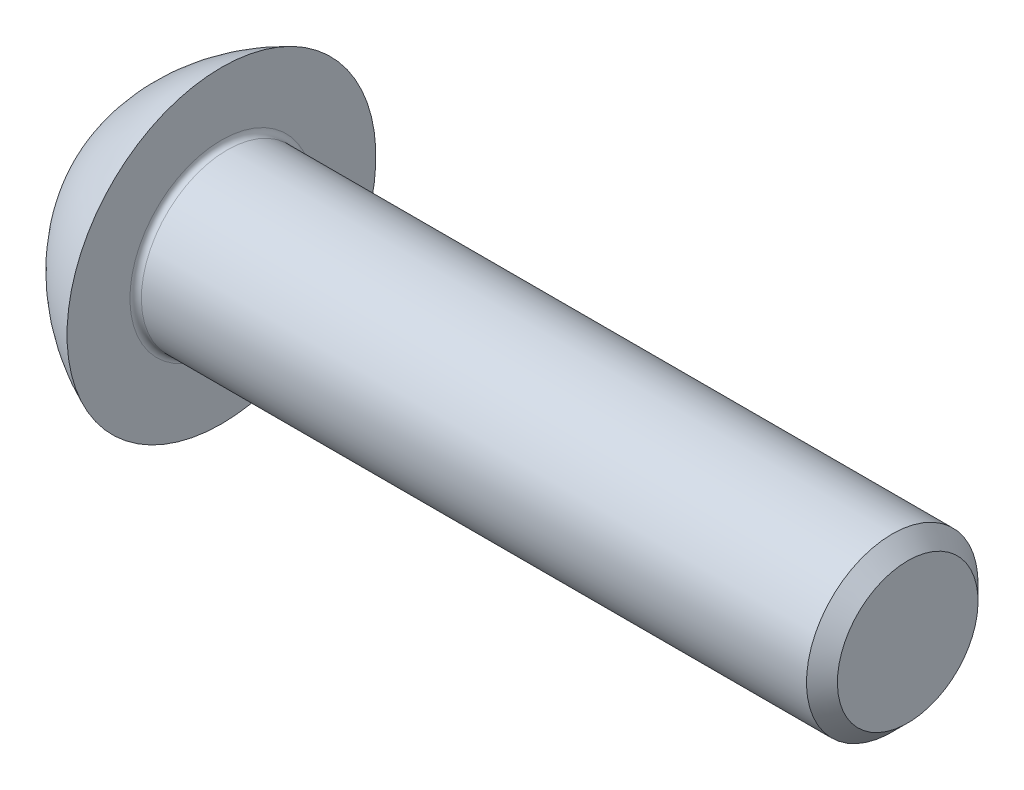
ISO-10303-21;
HEADER;
FILE_DESCRIPTION(('STEP AP214'),'2;1');
FILE_NAME('part.step','',(''),(''),'','','');
FILE_SCHEMA(('AUTOMOTIVE_DESIGN { 1 0 10303 214 1 1 1 1 }'));
ENDSEC;
DATA;
#1=APPLICATION_CONTEXT('core data for automotive mechanical design processes');
#2=APPLICATION_PROTOCOL_DEFINITION('international standard','automotive_design',2000,#1);
#3=PRODUCT_CONTEXT('',#1,'mechanical');
#4=PRODUCT('Part','Part','',(#3));
#5=PRODUCT_RELATED_PRODUCT_CATEGORY('part','',(#4));
#6=PRODUCT_DEFINITION_FORMATION('','',#4);
#7=PRODUCT_DEFINITION_CONTEXT('part definition',#1,'design');
#8=PRODUCT_DEFINITION('design','',#6,#7);
#9=PRODUCT_DEFINITION_SHAPE('','',#8);
#10=(LENGTH_UNIT() NAMED_UNIT(*) SI_UNIT(.MILLI.,.METRE.));
#11=(NAMED_UNIT(*) PLANE_ANGLE_UNIT() SI_UNIT($,.RADIAN.));
#12=(NAMED_UNIT(*) SI_UNIT($,.STERADIAN.) SOLID_ANGLE_UNIT());
#13=UNCERTAINTY_MEASURE_WITH_UNIT(LENGTH_MEASURE(1.E-05),#10,'distance_accuracy_value','');
#14=(GEOMETRIC_REPRESENTATION_CONTEXT(3) GLOBAL_UNCERTAINTY_ASSIGNED_CONTEXT((#13)) GLOBAL_UNIT_ASSIGNED_CONTEXT((#10,
#11,#12)) REPRESENTATION_CONTEXT('',''));
#15=CARTESIAN_POINT('',(0.,0.,0.));
#16=DIRECTION('',(0.,0.,1.));
#17=DIRECTION('',(1.,0.,0.));
#18=AXIS2_PLACEMENT_3D('',#15,#16,#17);
#19=CARTESIAN_POINT('',(-1.,-0.900666419935816,0.52));
#20=DIRECTION('',(0.,-0.866025403784439,0.5));
#21=DIRECTION('',(0.,-0.5,-0.866025403784439));
#22=AXIS2_PLACEMENT_3D('',#19,#20,#21);
#23=PLANE('',#22);
#24=DIRECTION('',(0.,-0.5,-0.866025403784439));
#25=VECTOR('',#24,1.);
#26=CARTESIAN_POINT('',(0.,-0.819416419935816,0.660729128114971));
#27=LINE('',#26,#25);
#28=CARTESIAN_POINT('',(0.,-0.600444279957211,1.04));
#29=VERTEX_POINT('',#28);
#30=CARTESIAN_POINT('',(0.,-1.20088855991442,0.));
#31=VERTEX_POINT('',#30);
#32=EDGE_CURVE('E32',#29,#31,#27,.T.);
#33=ORIENTED_EDGE('',*,*,#32,.F.);
#34=DIRECTION('',(1.,0.,0.));
#35=VECTOR('',#34,1.);
#36=CARTESIAN_POINT('',(-1.,-0.600444279957211,1.04));
#37=LINE('',#36,#35);
#38=CARTESIAN_POINT('',(1.04,-0.600444279957211,1.04));
#39=VERTEX_POINT('',#38);
#40=EDGE_CURVE('E11',#29,#39,#37,.T.);
#41=ORIENTED_EDGE('',*,*,#40,.T.);
#42=DIRECTION('',(0.,0.5,0.866025403784439));
#43=VECTOR('',#42,1.);
#44=CARTESIAN_POINT('',(1.04,-0.600444279957211,1.04));
#45=LINE('',#44,#43);
#46=CARTESIAN_POINT('',(1.04,-0.752876240745874,0.775980099216687));
#47=VERTEX_POINT('',#46);
#48=EDGE_CURVE('E232',#47,#39,#45,.T.);
#49=ORIENTED_EDGE('',*,*,#48,.F.);
#50=CARTESIAN_POINT('',(1.04,-0.752876240745875,0.775980099216688));
#51=CARTESIAN_POINT('',(1.03905947423286,-0.74357721040589,0.792086492226667));
#52=CARTESIAN_POINT('',(1.038,-0.73418518976256,0.808353949166648));
#53=(BOUNDED_CURVE() B_SPLINE_CURVE(2,(#50,#51,#52),.UNSPECIFIED.,.F.,
.F.) B_SPLINE_CURVE_WITH_KNOTS((3,3),(0.,0.0374356048378607),
.UNSPECIFIED.) CURVE() GEOMETRIC_REPRESENTATION_ITEM() RATIONAL_B_SPLINE_CURVE((1.,
1.00014797863071,1.)) REPRESENTATION_ITEM(''));
#54=CARTESIAN_POINT('',(1.038,-0.734185189762562,0.808353949166645));
#55=VERTEX_POINT('',#54);
#56=EDGE_CURVE('E25',#47,#55,#53,.T.);
#57=ORIENTED_EDGE('',*,*,#56,.T.);
#58=DIRECTION('',(0.,-0.5,-0.866025403784439));
#59=VECTOR('',#58,1.);
#60=CARTESIAN_POINT('',(1.038,-0.832416419935816,0.638212467616576));
#61=LINE('',#60,#59);
#62=CARTESIAN_POINT('',(1.038,-1.06714765010907,0.231646050833355));
#63=VERTEX_POINT('',#62);
#64=EDGE_CURVE('E150',#55,#63,#61,.T.);
#65=ORIENTED_EDGE('',*,*,#64,.T.);
#66=CARTESIAN_POINT('',(1.038,-1.06714765010907,0.231646050833352));
#67=CARTESIAN_POINT('',(1.03905947423286,-1.05775562946574,0.247913507773334));
#68=CARTESIAN_POINT('',(1.04,-1.04845659912576,0.264019900783313));
#69=(BOUNDED_CURVE() B_SPLINE_CURVE(2,(#66,#67,#68),.UNSPECIFIED.,.F.,
.F.) B_SPLINE_CURVE_WITH_KNOTS((3,3),(0.,0.0374356048378611),
.UNSPECIFIED.) CURVE() GEOMETRIC_REPRESENTATION_ITEM() RATIONAL_B_SPLINE_CURVE((1.,
1.00014797861765,1.)) REPRESENTATION_ITEM(''));
#70=CARTESIAN_POINT('',(1.04,-1.04845659912576,0.264019900783312));
#71=VERTEX_POINT('',#70);
#72=EDGE_CURVE('E138',#63,#71,#69,.T.);
#73=ORIENTED_EDGE('',*,*,#72,.T.);
#74=DIRECTION('',(0.,0.5,0.866025403784439));
#75=VECTOR('',#74,1.);
#76=CARTESIAN_POINT('',(1.04,-0.600444279957211,1.04));
#77=LINE('',#76,#75);
#78=CARTESIAN_POINT('',(1.04,-1.20088855991442,0.));
#79=VERTEX_POINT('',#78);
#80=EDGE_CURVE('E231',#79,#71,#77,.T.);
#81=ORIENTED_EDGE('',*,*,#80,.F.);
#82=DIRECTION('',(1.,0.,0.));
#83=VECTOR('',#82,1.);
#84=CARTESIAN_POINT('',(-1.,-1.20088855991442,0.));
#85=LINE('',#84,#83);
#86=EDGE_CURVE('E151',#31,#79,#85,.T.);
#87=ORIENTED_EDGE('',*,*,#86,.F.);
#88=EDGE_LOOP('',(#33,#41,#49,#57,#65,#73,#81,#87));
#89=FACE_BOUND('',#88,.T.);
#90=ADVANCED_FACE('F16',(#89),#23,.F.);
#91=CARTESIAN_POINT('',(-1.,-0.900666419935816,-0.52));
#92=DIRECTION('',(0.,-0.866025403784439,-0.5));
#93=DIRECTION('',(0.,0.5,-0.866025403784439));
#94=AXIS2_PLACEMENT_3D('',#91,#92,#93);
#95=PLANE('',#94);
#96=DIRECTION('',(0.,0.5,-0.866025403784439));
#97=VECTOR('',#96,1.);
#98=CARTESIAN_POINT('',(0.,-0.819416419935816,-0.660729128114971));
#99=LINE('',#98,#97);
#100=CARTESIAN_POINT('',(0.,-0.600444279957211,-1.04));
#101=VERTEX_POINT('',#100);
#102=EDGE_CURVE('E168',#31,#101,#99,.T.);
#103=ORIENTED_EDGE('',*,*,#102,.F.);
#104=ORIENTED_EDGE('',*,*,#86,.T.);
#105=DIRECTION('',(0.,-0.5,0.866025403784439));
#106=VECTOR('',#105,1.);
#107=CARTESIAN_POINT('',(1.04,-1.20088855991442,0.));
#108=LINE('',#107,#106);
#109=CARTESIAN_POINT('',(1.04,-1.04845659912576,-0.264019900783312));
#110=VERTEX_POINT('',#109);
#111=EDGE_CURVE('E274',#110,#79,#108,.T.);
#112=ORIENTED_EDGE('',*,*,#111,.F.);
#113=CARTESIAN_POINT('',(1.04,-1.04845659912576,-0.264019900783312));
#114=CARTESIAN_POINT('',(1.03905947423287,-1.05775562946569,-0.247913507773424));
#115=CARTESIAN_POINT('',(1.038,-1.06714765010907,-0.23164605083335));
#116=(BOUNDED_CURVE() B_SPLINE_CURVE(2,(#113,#114,#115),.UNSPECIFIED.,.F.,
.F.) B_SPLINE_CURVE_WITH_KNOTS((3,3),(0.,0.0374356048378617),
.UNSPECIFIED.) CURVE() GEOMETRIC_REPRESENTATION_ITEM() RATIONAL_B_SPLINE_CURVE((1.,
1.00014797862095,1.)) REPRESENTATION_ITEM(''));
#117=CARTESIAN_POINT('',(1.038,-1.06714765010907,-0.231646050833354));
#118=VERTEX_POINT('',#117);
#119=EDGE_CURVE('E268',#110,#118,#116,.T.);
#120=ORIENTED_EDGE('',*,*,#119,.T.);
#121=DIRECTION('',(0.,0.5,-0.866025403784439));
#122=VECTOR('',#121,1.);
#123=CARTESIAN_POINT('',(1.038,-0.832416419935816,-0.638212467616576));
#124=LINE('',#123,#122);
#125=CARTESIAN_POINT('',(1.038,-0.734185189762562,-0.808353949166645));
#126=VERTEX_POINT('',#125);
#127=EDGE_CURVE('E265',#118,#126,#124,.T.);
#128=ORIENTED_EDGE('',*,*,#127,.T.);
#129=CARTESIAN_POINT('',(1.038,-0.734185189762559,-0.808353949166649));
#130=CARTESIAN_POINT('',(1.03905947423287,-0.743577210405941,-0.792086492226576));
#131=CARTESIAN_POINT('',(1.04,-0.752876240745874,-0.775980099216688));
#132=(BOUNDED_CURVE() B_SPLINE_CURVE(2,(#129,#130,#131),.UNSPECIFIED.,.F.,
.F.) B_SPLINE_CURVE_WITH_KNOTS((3,3),(0.,0.0374356048378615),
.UNSPECIFIED.) CURVE() GEOMETRIC_REPRESENTATION_ITEM() RATIONAL_B_SPLINE_CURVE((1.,
1.00014797861121,1.)) REPRESENTATION_ITEM(''));
#133=CARTESIAN_POINT('',(1.04,-0.752876240745874,-0.775980099216688));
#134=VERTEX_POINT('',#133);
#135=EDGE_CURVE('E269',#126,#134,#132,.T.);
#136=ORIENTED_EDGE('',*,*,#135,.T.);
#137=DIRECTION('',(0.,-0.5,0.866025403784439));
#138=VECTOR('',#137,1.);
#139=CARTESIAN_POINT('',(1.04,-1.20088855991442,0.));
#140=LINE('',#139,#138);
#141=CARTESIAN_POINT('',(1.04,-0.600444279957211,-1.04));
#142=VERTEX_POINT('',#141);
#143=EDGE_CURVE('E244',#142,#134,#140,.T.);
#144=ORIENTED_EDGE('',*,*,#143,.F.);
#145=DIRECTION('',(1.,0.,0.));
#146=VECTOR('',#145,1.);
#147=CARTESIAN_POINT('',(-1.,-0.600444279957211,-1.04));
#148=LINE('',#147,#146);
#149=EDGE_CURVE('E257',#101,#142,#148,.T.);
#150=ORIENTED_EDGE('',*,*,#149,.F.);
#151=EDGE_LOOP('',(#103,#104,#112,#120,#128,#136,#144,#150));
#152=FACE_BOUND('',#151,.T.);
#153=ADVANCED_FACE('F388',(#152),#95,.F.);
#154=CARTESIAN_POINT('',(-1.,0.,-1.04));
#155=DIRECTION('',(0.,0.,-1.));
#156=DIRECTION('',(0.,1.,0.));
#157=AXIS2_PLACEMENT_3D('',#154,#155,#156);
#158=PLANE('',#157);
#159=DIRECTION('',(0.,1.,0.));
#160=VECTOR('',#159,1.);
#161=CARTESIAN_POINT('',(0.,0.325,-1.04));
#162=LINE('',#161,#160);
#163=CARTESIAN_POINT('',(0.,0.60044427995721,-1.04));
#164=VERTEX_POINT('',#163);
#165=EDGE_CURVE('E171',#101,#164,#162,.T.);
#166=ORIENTED_EDGE('',*,*,#165,.F.);
#167=ORIENTED_EDGE('',*,*,#149,.T.);
#168=DIRECTION('',(0.,-1.,0.));
#169=VECTOR('',#168,1.);
#170=CARTESIAN_POINT('',(1.04,-0.600444279957211,-1.04));
#171=LINE('',#170,#169);
#172=CARTESIAN_POINT('',(1.04,-0.295580358379884,-1.04));
#173=VERTEX_POINT('',#172);
#174=EDGE_CURVE('E249',#173,#142,#171,.T.);
#175=ORIENTED_EDGE('',*,*,#174,.F.);
#176=CARTESIAN_POINT('',(1.04,-0.295580358379884,-1.04));
#177=CARTESIAN_POINT('',(1.03905947423286,-0.314178419059819,-1.04));
#178=CARTESIAN_POINT('',(1.038,-0.332962460346514,-1.04));
#179=(BOUNDED_CURVE() B_SPLINE_CURVE(2,(#176,#177,#178),.UNSPECIFIED.,.F.,
.F.) B_SPLINE_CURVE_WITH_KNOTS((3,3),(0.,0.0374356048378617),
.UNSPECIFIED.) CURVE() GEOMETRIC_REPRESENTATION_ITEM() RATIONAL_B_SPLINE_CURVE((1.,
1.00014797861979,1.)) REPRESENTATION_ITEM(''));
#180=CARTESIAN_POINT('',(1.038,-0.332962460346509,-1.04));
#181=VERTEX_POINT('',#180);
#182=EDGE_CURVE('E253',#173,#181,#179,.T.);
#183=ORIENTED_EDGE('',*,*,#182,.T.);
#184=DIRECTION('',(0.,1.,0.));
#185=VECTOR('',#184,1.);
#186=CARTESIAN_POINT('',(1.038,0.273,-1.04));
#187=LINE('',#186,#185);
#188=CARTESIAN_POINT('',(1.038,0.332962460346509,-1.04));
#189=VERTEX_POINT('',#188);
#190=EDGE_CURVE('E258',#181,#189,#187,.T.);
#191=ORIENTED_EDGE('',*,*,#190,.T.);
#192=CARTESIAN_POINT('',(1.038,0.332962460346514,-1.04));
#193=CARTESIAN_POINT('',(1.03905947423286,0.314178419059819,-1.04));
#194=CARTESIAN_POINT('',(1.04,0.295580358379884,-1.04));
#195=(BOUNDED_CURVE() B_SPLINE_CURVE(2,(#192,#193,#194),.UNSPECIFIED.,.F.,
.F.) B_SPLINE_CURVE_WITH_KNOTS((3,3),(0.,0.0374356048378617),
.UNSPECIFIED.) CURVE() GEOMETRIC_REPRESENTATION_ITEM() RATIONAL_B_SPLINE_CURVE((1.,
1.00014797861979,1.)) REPRESENTATION_ITEM(''));
#196=CARTESIAN_POINT('',(1.04,0.295580358379884,-1.04));
#197=VERTEX_POINT('',#196);
#198=EDGE_CURVE('E280',#189,#197,#195,.T.);
#199=ORIENTED_EDGE('',*,*,#198,.T.);
#200=DIRECTION('',(0.,-1.,0.));
#201=VECTOR('',#200,1.);
#202=CARTESIAN_POINT('',(1.04,-0.600444279957211,-1.04));
#203=LINE('',#202,#201);
#204=CARTESIAN_POINT('',(1.04,0.60044427995721,-1.04));
#205=VERTEX_POINT('',#204);
#206=EDGE_CURVE('E277',#205,#197,#203,.T.);
#207=ORIENTED_EDGE('',*,*,#206,.F.);
#208=DIRECTION('',(1.,0.,0.));
#209=VECTOR('',#208,1.);
#210=CARTESIAN_POINT('',(-1.,0.60044427995721,-1.04));
#211=LINE('',#210,#209);
#212=EDGE_CURVE('E285',#164,#205,#211,.T.);
#213=ORIENTED_EDGE('',*,*,#212,.F.);
#214=EDGE_LOOP('',(#166,#167,#175,#183,#191,#199,#207,#213));
#215=FACE_BOUND('',#214,.T.);
#216=ADVANCED_FACE('F368',(#215),#158,.F.);
#217=CARTESIAN_POINT('',(-1.,0.900666419935816,-0.52));
#218=DIRECTION('',(0.,0.866025403784439,-0.5));
#219=DIRECTION('',(0.,0.5,0.866025403784439));
#220=AXIS2_PLACEMENT_3D('',#217,#218,#219);
#221=PLANE('',#220);
#222=DIRECTION('',(0.,0.5,0.866025403784439));
#223=VECTOR('',#222,1.);
#224=CARTESIAN_POINT('',(0.,0.981916419935816,-0.379270871885029));
#225=LINE('',#224,#223);
#226=CARTESIAN_POINT('',(0.,1.20088855991442,0.));
#227=VERTEX_POINT('',#226);
#228=EDGE_CURVE('E172',#164,#227,#225,.T.);
#229=ORIENTED_EDGE('',*,*,#228,.F.);
#230=ORIENTED_EDGE('',*,*,#212,.T.);
#231=DIRECTION('',(0.,-0.5,-0.866025403784439));
#232=VECTOR('',#231,1.);
#233=CARTESIAN_POINT('',(1.04,0.60044427995721,-1.04));
#234=LINE('',#233,#232);
#235=CARTESIAN_POINT('',(1.04,0.752876240745874,-0.775980099216688));
#236=VERTEX_POINT('',#235);
#237=EDGE_CURVE('E181',#236,#205,#234,.T.);
#238=ORIENTED_EDGE('',*,*,#237,.F.);
#239=CARTESIAN_POINT('',(1.04,0.752876240745876,-0.775980099216684));
#240=CARTESIAN_POINT('',(1.03905947423287,0.743577210405964,-0.792086492226539));
#241=CARTESIAN_POINT('',(1.038,0.734185189762562,-0.808353949166644));
#242=(BOUNDED_CURVE() B_SPLINE_CURVE(2,(#239,#240,#241),.UNSPECIFIED.,.F.,
.F.) B_SPLINE_CURVE_WITH_KNOTS((3,3),(0.,0.037435604837859),
.UNSPECIFIED.) CURVE() GEOMETRIC_REPRESENTATION_ITEM() RATIONAL_B_SPLINE_CURVE((1.,
1.00014797875194,1.)) REPRESENTATION_ITEM(''));
#243=CARTESIAN_POINT('',(1.038,0.734185189762561,-0.808353949166646));
#244=VERTEX_POINT('',#243);
#245=EDGE_CURVE('E345',#236,#244,#242,.T.);
#246=ORIENTED_EDGE('',*,*,#245,.T.);
#247=DIRECTION('',(0.,0.5,0.866025403784439));
#248=VECTOR('',#247,1.);
#249=CARTESIAN_POINT('',(1.038,0.968916419935816,-0.401787532383424));
#250=LINE('',#249,#248);
#251=CARTESIAN_POINT('',(1.038,1.06714765010907,-0.231646050833355));
#252=VERTEX_POINT('',#251);
#253=EDGE_CURVE('E305',#244,#252,#250,.T.);
#254=ORIENTED_EDGE('',*,*,#253,.T.);
#255=CARTESIAN_POINT('',(1.038,1.06714765010907,-0.231646050833356));
#256=CARTESIAN_POINT('',(1.03905947423287,1.05775562946567,-0.247913507773464));
#257=CARTESIAN_POINT('',(1.04,1.04845659912575,-0.264019900783316));
#258=(BOUNDED_CURVE() B_SPLINE_CURVE(2,(#255,#256,#257),.UNSPECIFIED.,.F.,
.F.) B_SPLINE_CURVE_WITH_KNOTS((3,3),(0.,0.037435604837859),
.UNSPECIFIED.) CURVE() GEOMETRIC_REPRESENTATION_ITEM() RATIONAL_B_SPLINE_CURVE((1.,
1.00014797874819,1.)) REPRESENTATION_ITEM(''));
#259=CARTESIAN_POINT('',(1.04,1.04845659912576,-0.264019900783312));
#260=VERTEX_POINT('',#259);
#261=EDGE_CURVE('E180',#252,#260,#258,.T.);
#262=ORIENTED_EDGE('',*,*,#261,.T.);
#263=DIRECTION('',(0.,-0.5,-0.866025403784439));
#264=VECTOR('',#263,1.);
#265=CARTESIAN_POINT('',(1.04,0.60044427995721,-1.04));
#266=LINE('',#265,#264);
#267=CARTESIAN_POINT('',(1.04,1.20088855991442,0.));
#268=VERTEX_POINT('',#267);
#269=EDGE_CURVE('E191',#268,#260,#266,.T.);
#270=ORIENTED_EDGE('',*,*,#269,.F.);
#271=DIRECTION('',(1.,0.,0.));
#272=VECTOR('',#271,1.);
#273=CARTESIAN_POINT('',(-1.,1.20088855991442,0.));
#274=LINE('',#273,#272);
#275=EDGE_CURVE('E243',#227,#268,#274,.T.);
#276=ORIENTED_EDGE('',*,*,#275,.F.);
#277=EDGE_LOOP('',(#229,#230,#238,#246,#254,#262,#270,#276));
#278=FACE_BOUND('',#277,.T.);
#279=ADVANCED_FACE('F349',(#278),#221,.F.);
#280=CARTESIAN_POINT('',(1.04,0.,0.));
#281=DIRECTION('',(1.,0.,0.));
#282=DIRECTION('',(0.,0.,-1.));
#283=AXIS2_PLACEMENT_3D('',#280,#281,#282);
#284=PLANE('',#283);
#285=CARTESIAN_POINT('',(1.04,0.,0.));
#286=DIRECTION('',(1.,0.,0.));
#287=DIRECTION('',(0.,1.,0.));
#288=AXIS2_PLACEMENT_3D('',#285,#286,#287);
#289=CIRCLE('',#288,1.08118811881188);
#290=EDGE_CURVE('E177',#197,#236,#289,.T.);
#291=ORIENTED_EDGE('',*,*,#290,.T.);
#292=ORIENTED_EDGE('',*,*,#237,.T.);
#293=ORIENTED_EDGE('',*,*,#206,.T.);
#294=EDGE_LOOP('',(#291,#292,#293));
#295=FACE_BOUND('',#294,.T.);
#296=ADVANCED_FACE('F364',(#295),#284,.F.);
#297=CARTESIAN_POINT('',(1.04,0.,0.));
#298=DIRECTION('',(1.,0.,0.));
#299=DIRECTION('',(0.,0.,-1.));
#300=AXIS2_PLACEMENT_3D('',#297,#298,#299);
#301=PLANE('',#300);
#302=CARTESIAN_POINT('',(1.04,0.,0.));
#303=DIRECTION('',(1.,0.,0.));
#304=DIRECTION('',(0.,1.,0.));
#305=AXIS2_PLACEMENT_3D('',#302,#303,#304);
#306=CIRCLE('',#305,1.08118811881188);
#307=EDGE_CURVE('E252',#134,#173,#306,.T.);
#308=ORIENTED_EDGE('',*,*,#307,.T.);
#309=ORIENTED_EDGE('',*,*,#174,.T.);
#310=ORIENTED_EDGE('',*,*,#143,.T.);
#311=EDGE_LOOP('',(#308,#309,#310));
#312=FACE_BOUND('',#311,.T.);
#313=ADVANCED_FACE('F454',(#312),#301,.F.);
#314=CARTESIAN_POINT('',(1.04,0.,0.));
#315=DIRECTION('',(1.,0.,0.));
#316=DIRECTION('',(0.,0.,-1.));
#317=AXIS2_PLACEMENT_3D('',#314,#315,#316);
#318=PLANE('',#317);
#319=CARTESIAN_POINT('',(1.04,0.,0.));
#320=DIRECTION('',(1.,0.,0.));
#321=DIRECTION('',(0.,1.,0.));
#322=AXIS2_PLACEMENT_3D('',#319,#320,#321);
#323=CIRCLE('',#322,1.08118811881188);
#324=EDGE_CURVE('E148',#71,#110,#323,.T.);
#325=ORIENTED_EDGE('',*,*,#324,.T.);
#326=ORIENTED_EDGE('',*,*,#111,.T.);
#327=ORIENTED_EDGE('',*,*,#80,.T.);
#328=EDGE_LOOP('',(#325,#326,#327));
#329=FACE_BOUND('',#328,.T.);
#330=ADVANCED_FACE('F451',(#329),#318,.F.);
#331=CARTESIAN_POINT('',(1.04,0.,0.));
#332=DIRECTION('',(1.,0.,0.));
#333=DIRECTION('',(0.,0.,-1.));
#334=AXIS2_PLACEMENT_3D('',#331,#332,#333);
#335=PLANE('',#334);
#336=CARTESIAN_POINT('',(1.04,0.,0.));
#337=DIRECTION('',(1.,0.,0.));
#338=DIRECTION('',(0.,1.,0.));
#339=AXIS2_PLACEMENT_3D('',#336,#337,#338);
#340=CIRCLE('',#339,1.08118811881188);
#341=CARTESIAN_POINT('',(1.04,-0.295580358379883,1.04));
#342=VERTEX_POINT('',#341);
#343=EDGE_CURVE('E228',#342,#47,#340,.T.);
#344=ORIENTED_EDGE('',*,*,#343,.T.);
#345=ORIENTED_EDGE('',*,*,#48,.T.);
#346=DIRECTION('',(0.,1.,0.));
#347=VECTOR('',#346,1.);
#348=CARTESIAN_POINT('',(1.04,0.600444279957211,1.04));
#349=LINE('',#348,#347);
#350=EDGE_CURVE('E236',#39,#342,#349,.T.);
#351=ORIENTED_EDGE('',*,*,#350,.T.);
#352=EDGE_LOOP('',(#344,#345,#351));
#353=FACE_BOUND('',#352,.T.);
#354=ADVANCED_FACE('F446',(#353),#335,.F.);
#355=CARTESIAN_POINT('',(1.04,0.,0.));
#356=DIRECTION('',(1.,0.,0.));
#357=DIRECTION('',(0.,0.,-1.));
#358=AXIS2_PLACEMENT_3D('',#355,#356,#357);
#359=PLANE('',#358);
#360=CARTESIAN_POINT('',(1.04,0.,0.));
#361=DIRECTION('',(1.,0.,0.));
#362=DIRECTION('',(0.,1.,0.));
#363=AXIS2_PLACEMENT_3D('',#360,#361,#362);
#364=CIRCLE('',#363,1.08118811881188);
#365=CARTESIAN_POINT('',(1.04,0.752876240745875,0.775980099216687));
#366=VERTEX_POINT('',#365);
#367=CARTESIAN_POINT('',(1.04,0.295580358379884,1.04));
#368=VERTEX_POINT('',#367);
#369=EDGE_CURVE('E185',#366,#368,#364,.T.);
#370=ORIENTED_EDGE('',*,*,#369,.T.);
#371=DIRECTION('',(0.,1.,0.));
#372=VECTOR('',#371,1.);
#373=CARTESIAN_POINT('',(1.04,0.600444279957211,1.04));
#374=LINE('',#373,#372);
#375=CARTESIAN_POINT('',(1.04,0.600444279957211,1.04));
#376=VERTEX_POINT('',#375);
#377=EDGE_CURVE('E182',#368,#376,#374,.T.);
#378=ORIENTED_EDGE('',*,*,#377,.T.);
#379=DIRECTION('',(0.,0.5,-0.866025403784439));
#380=VECTOR('',#379,1.);
#381=CARTESIAN_POINT('',(1.04,1.20088855991442,0.));
#382=LINE('',#381,#380);
#383=EDGE_CURVE('E186',#376,#366,#382,.T.);
#384=ORIENTED_EDGE('',*,*,#383,.T.);
#385=EDGE_LOOP('',(#370,#378,#384));
#386=FACE_BOUND('',#385,.T.);
#387=ADVANCED_FACE('F443',(#386),#359,.F.);
#388=CARTESIAN_POINT('',(1.04,0.,0.));
#389=DIRECTION('',(1.,0.,0.));
#390=DIRECTION('',(0.,0.,-1.));
#391=AXIS2_PLACEMENT_3D('',#388,#389,#390);
#392=PLANE('',#391);
#393=CARTESIAN_POINT('',(1.04,0.,0.));
#394=DIRECTION('',(1.,0.,0.));
#395=DIRECTION('',(0.,1.,0.));
#396=AXIS2_PLACEMENT_3D('',#393,#394,#395);
#397=CIRCLE('',#396,1.08118811881188);
#398=CARTESIAN_POINT('',(1.04,1.04845659912576,0.264019900783312));
#399=VERTEX_POINT('',#398);
#400=EDGE_CURVE('E205',#260,#399,#397,.T.);
#401=ORIENTED_EDGE('',*,*,#400,.T.);
#402=DIRECTION('',(0.,0.5,-0.866025403784439));
#403=VECTOR('',#402,1.);
#404=CARTESIAN_POINT('',(1.04,1.20088855991442,0.));
#405=LINE('',#404,#403);
#406=EDGE_CURVE('E193',#399,#268,#405,.T.);
#407=ORIENTED_EDGE('',*,*,#406,.T.);
#408=ORIENTED_EDGE('',*,*,#269,.T.);
#409=EDGE_LOOP('',(#401,#407,#408));
#410=FACE_BOUND('',#409,.T.);
#411=ADVANCED_FACE('F433',(#410),#392,.F.);
#412=CARTESIAN_POINT('',(-1.,0.,1.04));
#413=DIRECTION('',(0.,0.,1.));
#414=DIRECTION('',(0.,-1.,0.));
#415=AXIS2_PLACEMENT_3D('',#412,#413,#414);
#416=PLANE('',#415);
#417=DIRECTION('',(0.,-1.,0.));
#418=VECTOR('',#417,1.);
#419=CARTESIAN_POINT('',(0.,0.325,1.04));
#420=LINE('',#419,#418);
#421=CARTESIAN_POINT('',(0.,0.600444279957211,1.04));
#422=VERTEX_POINT('',#421);
#423=EDGE_CURVE('E273',#422,#29,#420,.T.);
#424=ORIENTED_EDGE('',*,*,#423,.F.);
#425=DIRECTION('',(1.,0.,0.));
#426=VECTOR('',#425,1.);
#427=CARTESIAN_POINT('',(-1.,0.600444279957211,1.04));
#428=LINE('',#427,#426);
#429=EDGE_CURVE('E194',#422,#376,#428,.T.);
#430=ORIENTED_EDGE('',*,*,#429,.T.);
#431=ORIENTED_EDGE('',*,*,#377,.F.);
#432=CARTESIAN_POINT('',(1.04,0.295580358379885,1.04));
#433=CARTESIAN_POINT('',(1.03905947423286,0.314178419059821,1.04));
#434=CARTESIAN_POINT('',(1.038,0.332962460346514,1.04));
#435=(BOUNDED_CURVE() B_SPLINE_CURVE(2,(#432,#433,#434),.UNSPECIFIED.,.F.,
.F.) B_SPLINE_CURVE_WITH_KNOTS((3,3),(0.,0.0374356048378608),
.UNSPECIFIED.) CURVE() GEOMETRIC_REPRESENTATION_ITEM() RATIONAL_B_SPLINE_CURVE((1.,
1.0001479786181,1.)) REPRESENTATION_ITEM(''));
#436=CARTESIAN_POINT('',(1.038,0.33296246034651,1.04));
#437=VERTEX_POINT('',#436);
#438=EDGE_CURVE('E208',#368,#437,#435,.T.);
#439=ORIENTED_EDGE('',*,*,#438,.T.);
#440=DIRECTION('',(0.,-1.,0.));
#441=VECTOR('',#440,1.);
#442=CARTESIAN_POINT('',(1.038,0.273,1.04));
#443=LINE('',#442,#441);
#444=CARTESIAN_POINT('',(1.038,-0.33296246034651,1.04));
#445=VERTEX_POINT('',#444);
#446=EDGE_CURVE('E213',#437,#445,#443,.T.);
#447=ORIENTED_EDGE('',*,*,#446,.T.);
#448=CARTESIAN_POINT('',(1.038,-0.332962460346514,1.04));
#449=CARTESIAN_POINT('',(1.03905947423286,-0.314178419059821,1.04));
#450=CARTESIAN_POINT('',(1.04,-0.295580358379885,1.04));
#451=(BOUNDED_CURVE() B_SPLINE_CURVE(2,(#448,#449,#450),.UNSPECIFIED.,.F.,
.F.) B_SPLINE_CURVE_WITH_KNOTS((3,3),(0.,0.0374356048378608),
.UNSPECIFIED.) CURVE() GEOMETRIC_REPRESENTATION_ITEM() RATIONAL_B_SPLINE_CURVE((1.,
1.00014797862319,1.)) REPRESENTATION_ITEM(''));
#452=EDGE_CURVE('E238',#445,#342,#451,.T.);
#453=ORIENTED_EDGE('',*,*,#452,.T.);
#454=ORIENTED_EDGE('',*,*,#350,.F.);
#455=ORIENTED_EDGE('',*,*,#40,.F.);
#456=EDGE_LOOP('',(#424,#430,#431,#439,#447,#453,#454,#455));
#457=FACE_BOUND('',#456,.T.);
#458=ADVANCED_FACE('F459',(#457),#416,.F.);
#459=CARTESIAN_POINT('',(-1.,0.900666419935816,0.52));
#460=DIRECTION('',(0.,0.866025403784439,0.5));
#461=DIRECTION('',(0.,-0.5,0.866025403784439));
#462=AXIS2_PLACEMENT_3D('',#459,#460,#461);
#463=PLANE('',#462);
#464=DIRECTION('',(0.,-0.5,0.866025403784439));
#465=VECTOR('',#464,1.);
#466=CARTESIAN_POINT('',(0.,0.981916419935816,0.379270871885029));
#467=LINE('',#466,#465);
#468=EDGE_CURVE('E176',#227,#422,#467,.T.);
#469=ORIENTED_EDGE('',*,*,#468,.F.);
#470=ORIENTED_EDGE('',*,*,#275,.T.);
#471=ORIENTED_EDGE('',*,*,#406,.F.);
#472=CARTESIAN_POINT('',(1.04,1.04845659912576,0.264019900783313));
#473=CARTESIAN_POINT('',(1.03905947423286,1.05775562946574,0.247913507773334));
#474=CARTESIAN_POINT('',(1.038,1.06714765010907,0.231646050833351));
#475=(BOUNDED_CURVE() B_SPLINE_CURVE(2,(#472,#473,#474),.UNSPECIFIED.,.F.,
.F.) B_SPLINE_CURVE_WITH_KNOTS((3,3),(0.,0.0374356048378618),
.UNSPECIFIED.) CURVE() GEOMETRIC_REPRESENTATION_ITEM() RATIONAL_B_SPLINE_CURVE((1.,
1.00014797861721,1.)) REPRESENTATION_ITEM(''));
#476=CARTESIAN_POINT('',(1.038,1.06714765010907,0.231646050833354));
#477=VERTEX_POINT('',#476);
#478=EDGE_CURVE('E189',#399,#477,#475,.T.);
#479=ORIENTED_EDGE('',*,*,#478,.T.);
#480=DIRECTION('',(0.,-0.5,0.866025403784439));
#481=VECTOR('',#480,1.);
#482=CARTESIAN_POINT('',(1.038,0.968916419935816,0.401787532383424));
#483=LINE('',#482,#481);
#484=CARTESIAN_POINT('',(1.038,0.734185189762563,0.808353949166645));
#485=VERTEX_POINT('',#484);
#486=EDGE_CURVE('E187',#477,#485,#483,.T.);
#487=ORIENTED_EDGE('',*,*,#486,.T.);
#488=CARTESIAN_POINT('',(1.038,0.734185189762561,0.808353949166648));
#489=CARTESIAN_POINT('',(1.03905947423286,0.743577210405889,0.792086492226667));
#490=CARTESIAN_POINT('',(1.04,0.752876240745875,0.775980099216687));
#491=(BOUNDED_CURVE() B_SPLINE_CURVE(2,(#488,#489,#490),.UNSPECIFIED.,.F.,
.F.) B_SPLINE_CURVE_WITH_KNOTS((3,3),(0.,0.0374356048378615),
.UNSPECIFIED.) CURVE() GEOMETRIC_REPRESENTATION_ITEM() RATIONAL_B_SPLINE_CURVE((1.,
1.00014797861975,1.)) REPRESENTATION_ITEM(''));
#492=EDGE_CURVE('E161',#485,#366,#491,.T.);
#493=ORIENTED_EDGE('',*,*,#492,.T.);
#494=ORIENTED_EDGE('',*,*,#383,.F.);
#495=ORIENTED_EDGE('',*,*,#429,.F.);
#496=EDGE_LOOP('',(#469,#470,#471,#479,#487,#493,#494,#495));
#497=FACE_BOUND('',#496,.T.);
#498=ADVANCED_FACE('F18',(#497),#463,.F.);
#499=CARTESIAN_POINT('',(1.038,0.546,0.));
#500=DIRECTION('',(-1.,0.,0.));
#501=DIRECTION('',(0.,-1.,0.));
#502=AXIS2_PLACEMENT_3D('',#499,#500,#501);
#503=PLANE('',#502);
#504=ORIENTED_EDGE('',*,*,#446,.F.);
#505=CARTESIAN_POINT('',(1.038,0.,0.));
#506=DIRECTION('',(1.,0.,0.));
#507=DIRECTION('',(0.,1.,0.));
#508=AXIS2_PLACEMENT_3D('',#505,#506,#507);
#509=CIRCLE('',#508,1.092);
#510=EDGE_CURVE('E157',#437,#445,#509,.T.);
#511=ORIENTED_EDGE('',*,*,#510,.T.);
#512=EDGE_LOOP('',(#504,#511));
#513=FACE_BOUND('',#512,.T.);
#514=ADVANCED_FACE('F464',(#513),#503,.F.);
#515=CARTESIAN_POINT('',(1.038,0.546,0.));
#516=DIRECTION('',(-1.,0.,0.));
#517=DIRECTION('',(0.,-1.,0.));
#518=AXIS2_PLACEMENT_3D('',#515,#516,#517);
#519=PLANE('',#518);
#520=ORIENTED_EDGE('',*,*,#64,.F.);
#521=CARTESIAN_POINT('',(1.038,0.,0.));
#522=DIRECTION('',(1.,0.,0.));
#523=DIRECTION('',(0.,1.,0.));
#524=AXIS2_PLACEMENT_3D('',#521,#522,#523);
#525=CIRCLE('',#524,1.092);
#526=EDGE_CURVE('E145',#55,#63,#525,.T.);
#527=ORIENTED_EDGE('',*,*,#526,.T.);
#528=EDGE_LOOP('',(#520,#527));
#529=FACE_BOUND('',#528,.T.);
#530=ADVANCED_FACE('F156',(#529),#519,.F.);
#531=CARTESIAN_POINT('',(1.038,0.546,0.));
#532=DIRECTION('',(-1.,0.,0.));
#533=DIRECTION('',(0.,-1.,0.));
#534=AXIS2_PLACEMENT_3D('',#531,#532,#533);
#535=PLANE('',#534);
#536=ORIENTED_EDGE('',*,*,#127,.F.);
#537=CARTESIAN_POINT('',(1.038,0.,0.));
#538=DIRECTION('',(1.,0.,0.));
#539=DIRECTION('',(0.,1.,0.));
#540=AXIS2_PLACEMENT_3D('',#537,#538,#539);
#541=CIRCLE('',#540,1.092);
#542=EDGE_CURVE('E158',#118,#126,#541,.T.);
#543=ORIENTED_EDGE('',*,*,#542,.T.);
#544=EDGE_LOOP('',(#536,#543));
#545=FACE_BOUND('',#544,.T.);
#546=ADVANCED_FACE('F374',(#545),#535,.F.);
#547=CARTESIAN_POINT('',(1.038,0.546,0.));
#548=DIRECTION('',(-1.,0.,0.));
#549=DIRECTION('',(0.,-1.,0.));
#550=AXIS2_PLACEMENT_3D('',#547,#548,#549);
#551=PLANE('',#550);
#552=ORIENTED_EDGE('',*,*,#190,.F.);
#553=CARTESIAN_POINT('',(1.038,0.,0.));
#554=DIRECTION('',(1.,0.,0.));
#555=DIRECTION('',(0.,1.,0.));
#556=AXIS2_PLACEMENT_3D('',#553,#554,#555);
#557=CIRCLE('',#556,1.092);
#558=EDGE_CURVE('E164',#181,#189,#557,.T.);
#559=ORIENTED_EDGE('',*,*,#558,.T.);
#560=EDGE_LOOP('',(#552,#559));
#561=FACE_BOUND('',#560,.T.);
#562=ADVANCED_FACE('F372',(#561),#551,.F.);
#563=CARTESIAN_POINT('',(1.038,0.546,0.));
#564=DIRECTION('',(-1.,0.,0.));
#565=DIRECTION('',(0.,-1.,0.));
#566=AXIS2_PLACEMENT_3D('',#563,#564,#565);
#567=PLANE('',#566);
#568=ORIENTED_EDGE('',*,*,#253,.F.);
#569=CARTESIAN_POINT('',(1.038,0.,0.));
#570=DIRECTION('',(1.,0.,0.));
#571=DIRECTION('',(0.,1.,0.));
#572=AXIS2_PLACEMENT_3D('',#569,#570,#571);
#573=CIRCLE('',#572,1.092);
#574=EDGE_CURVE('E235',#244,#252,#573,.T.);
#575=ORIENTED_EDGE('',*,*,#574,.T.);
#576=EDGE_LOOP('',(#568,#575));
#577=FACE_BOUND('',#576,.T.);
#578=ADVANCED_FACE('F340',(#577),#567,.F.);
#579=CARTESIAN_POINT('',(1.038,0.546,0.));
#580=DIRECTION('',(-1.,0.,0.));
#581=DIRECTION('',(0.,-1.,0.));
#582=AXIS2_PLACEMENT_3D('',#579,#580,#581);
#583=PLANE('',#582);
#584=ORIENTED_EDGE('',*,*,#486,.F.);
#585=CARTESIAN_POINT('',(1.038,0.,0.));
#586=DIRECTION('',(1.,0.,0.));
#587=DIRECTION('',(0.,1.,0.));
#588=AXIS2_PLACEMENT_3D('',#585,#586,#587);
#589=CIRCLE('',#588,1.092);
#590=EDGE_CURVE('E175',#477,#485,#589,.T.);
#591=ORIENTED_EDGE('',*,*,#590,.T.);
#592=EDGE_LOOP('',(#584,#591));
#593=FACE_BOUND('',#592,.T.);
#594=ADVANCED_FACE('F381',(#593),#583,.F.);
#595=CARTESIAN_POINT('',(1.139,0.,0.));
#596=DIRECTION('',(-1.,0.,0.));
#597=DIRECTION('',(0.,1.,0.));
#598=AXIS2_PLACEMENT_3D('',#595,#596,#597);
#599=CONICAL_SURFACE('',#598,0.546,1.38788226954824);
#600=ORIENTED_EDGE('',*,*,#478,.F.);
#601=ORIENTED_EDGE('',*,*,#400,.F.);
#602=ORIENTED_EDGE('',*,*,#261,.F.);
#603=ORIENTED_EDGE('',*,*,#574,.F.);
#604=ORIENTED_EDGE('',*,*,#245,.F.);
#605=ORIENTED_EDGE('',*,*,#290,.F.);
#606=ORIENTED_EDGE('',*,*,#198,.F.);
#607=ORIENTED_EDGE('',*,*,#558,.F.);
#608=ORIENTED_EDGE('',*,*,#182,.F.);
#609=ORIENTED_EDGE('',*,*,#307,.F.);
#610=ORIENTED_EDGE('',*,*,#135,.F.);
#611=ORIENTED_EDGE('',*,*,#542,.F.);
#612=ORIENTED_EDGE('',*,*,#119,.F.);
#613=ORIENTED_EDGE('',*,*,#324,.F.);
#614=ORIENTED_EDGE('',*,*,#72,.F.);
#615=ORIENTED_EDGE('',*,*,#526,.F.);
#616=ORIENTED_EDGE('',*,*,#56,.F.);
#617=ORIENTED_EDGE('',*,*,#343,.F.);
#618=ORIENTED_EDGE('',*,*,#452,.F.);
#619=ORIENTED_EDGE('',*,*,#510,.F.);
#620=ORIENTED_EDGE('',*,*,#438,.F.);
#621=ORIENTED_EDGE('',*,*,#369,.F.);
#622=ORIENTED_EDGE('',*,*,#492,.F.);
#623=ORIENTED_EDGE('',*,*,#590,.F.);
#624=EDGE_LOOP('',(#600,#601,#602,#603,#604,#605,#606,#607,#608,#609,#610,#611,#612,#613,#614,
#615,#616,#617,#618,#619,#620,#621,#622,#623));
#625=FACE_BOUND('',#624,.T.);
#626=CARTESIAN_POINT('',(1.24,0.,0.));
#627=VERTEX_POINT('',#626);
#628=VERTEX_LOOP('',#627);
#629=FACE_BOUND('',#628,.T.);
#630=ADVANCED_FACE('F141',(#625,#629),#599,.F.);
#631=CARTESIAN_POINT('',(0.,0.65,0.));
#632=DIRECTION('',(-1.,0.,0.));
#633=DIRECTION('',(0.,-1.,0.));
#634=AXIS2_PLACEMENT_3D('',#631,#632,#633);
#635=PLANE('',#634);
#636=ORIENTED_EDGE('',*,*,#228,.T.);
#637=ORIENTED_EDGE('',*,*,#468,.T.);
#638=ORIENTED_EDGE('',*,*,#423,.T.);
#639=ORIENTED_EDGE('',*,*,#32,.T.);
#640=ORIENTED_EDGE('',*,*,#102,.T.);
#641=ORIENTED_EDGE('',*,*,#165,.T.);
#642=EDGE_LOOP('',(#636,#637,#638,#639,#640,#641));
#643=FACE_BOUND('',#642,.T.);
#644=CARTESIAN_POINT('',(0.,0.,0.));
#645=DIRECTION('',(1.,0.,0.));
#646=DIRECTION('',(0.,1.,0.));
#647=AXIS2_PLACEMENT_3D('',#644,#645,#646);
#648=CIRCLE('',#647,1.3);
#649=CARTESIAN_POINT('',(0.,1.3,0.));
#650=VERTEX_POINT('',#649);
#651=EDGE_CURVE('E221',#650,#650,#648,.T.);
#652=ORIENTED_EDGE('',*,*,#651,.F.);
#653=EDGE_LOOP('',(#652));
#654=FACE_BOUND('',#653,.T.);
#655=ADVANCED_FACE('F440',(#643,#654),#635,.T.);
#656=CARTESIAN_POINT('',(3.1141827613574,0.,0.));
#657=DIRECTION('',(1.,0.,0.));
#658=DIRECTION('',(0.,0.,1.));
#659=AXIS2_PLACEMENT_3D('',#656,#657,#658);
#660=DEGENERATE_TOROIDAL_SURFACE('',#659,0.697965397314078,3.7,.F.);
#661=CARTESIAN_POINT('',(1.65,0.,0.));
#662=DIRECTION('',(1.,0.,0.));
#663=DIRECTION('',(0.,1.,0.));
#664=AXIS2_PLACEMENT_3D('',#661,#662,#663);
#665=CIRCLE('',#664,2.7);
#666=CARTESIAN_POINT('',(1.65,2.7,0.));
#667=VERTEX_POINT('',#666);
#668=EDGE_CURVE('E218',#667,#667,#665,.T.);
#669=ORIENTED_EDGE('',*,*,#668,.F.);
#670=EDGE_LOOP('',(#669));
#671=FACE_BOUND('',#670,.T.);
#672=ORIENTED_EDGE('',*,*,#651,.T.);
#673=EDGE_LOOP('',(#672));
#674=FACE_BOUND('',#673,.T.);
#675=ADVANCED_FACE('F396',(#671,#674),#660,.F.);
#676=CARTESIAN_POINT('',(1.65,2.15,0.));
#677=DIRECTION('',(1.,0.,0.));
#678=DIRECTION('',(0.,1.,0.));
#679=AXIS2_PLACEMENT_3D('',#676,#677,#678);
#680=PLANE('',#679);
#681=CARTESIAN_POINT('',(1.65,0.,0.));
#682=DIRECTION('',(1.,0.,0.));
#683=DIRECTION('',(0.,1.,0.));
#684=AXIS2_PLACEMENT_3D('',#681,#682,#683);
#685=CIRCLE('',#684,1.6);
#686=CARTESIAN_POINT('',(1.65,1.6,0.));
#687=VERTEX_POINT('',#686);
#688=EDGE_CURVE('E222',#687,#687,#685,.T.);
#689=ORIENTED_EDGE('',*,*,#688,.F.);
#690=EDGE_LOOP('',(#689));
#691=FACE_BOUND('',#690,.T.);
#692=ORIENTED_EDGE('',*,*,#668,.T.);
#693=EDGE_LOOP('',(#692));
#694=FACE_BOUND('',#693,.T.);
#695=ADVANCED_FACE('F401',(#691,#694),#680,.T.);
#696=CARTESIAN_POINT('',(1.75,0.,0.));
#697=DIRECTION('',(1.,0.,0.));
#698=DIRECTION('',(0.,0.,-1.));
#699=AXIS2_PLACEMENT_3D('',#696,#697,#698);
#700=TOROIDAL_SURFACE('',#699,1.6,0.1);
#701=CARTESIAN_POINT('',(1.75,0.,0.));
#702=DIRECTION('',(1.,0.,0.));
#703=DIRECTION('',(0.,1.,0.));
#704=AXIS2_PLACEMENT_3D('',#701,#702,#703);
#705=CIRCLE('',#704,1.5);
#706=CARTESIAN_POINT('',(1.75,1.5,0.));
#707=VERTEX_POINT('',#706);
#708=EDGE_CURVE('E226',#707,#707,#705,.T.);
#709=ORIENTED_EDGE('',*,*,#708,.F.);
#710=EDGE_LOOP('',(#709));
#711=FACE_BOUND('',#710,.T.);
#712=ORIENTED_EDGE('',*,*,#688,.T.);
#713=EDGE_LOOP('',(#712));
#714=FACE_BOUND('',#713,.T.);
#715=ADVANCED_FACE('F398',(#711,#714),#700,.F.);
#716=CARTESIAN_POINT('',(7.5646875,0.,0.));
#717=DIRECTION('',(-1.,0.,0.));
#718=DIRECTION('',(0.,1.,0.));
#719=AXIS2_PLACEMENT_3D('',#716,#717,#718);
#720=CYLINDRICAL_SURFACE('',#719,1.5);
#721=CARTESIAN_POINT('',(13.379375,0.,0.));
#722=DIRECTION('',(1.,0.,0.));
#723=DIRECTION('',(0.,1.,0.));
#724=AXIS2_PLACEMENT_3D('',#721,#722,#723);
#725=CIRCLE('',#724,1.5);
#726=CARTESIAN_POINT('',(13.379375,1.5,0.));
#727=VERTEX_POINT('',#726);
#728=EDGE_CURVE('E223',#727,#727,#725,.T.);
#729=ORIENTED_EDGE('',*,*,#728,.F.);
#730=EDGE_LOOP('',(#729));
#731=FACE_BOUND('',#730,.T.);
#732=ORIENTED_EDGE('',*,*,#708,.T.);
#733=EDGE_LOOP('',(#732));
#734=FACE_BOUND('',#733,.T.);
#735=ADVANCED_FACE('F400',(#731,#734),#720,.T.);
#736=CARTESIAN_POINT('',(13.5146875,0.,0.));
#737=DIRECTION('',(-1.,0.,0.));
#738=DIRECTION('',(0.,1.,0.));
#739=AXIS2_PLACEMENT_3D('',#736,#737,#738);
#740=CONICAL_SURFACE('',#739,1.3646875,0.785398163397449);
#741=CARTESIAN_POINT('',(13.65,0.,0.));
#742=DIRECTION('',(1.,0.,0.));
#743=DIRECTION('',(0.,1.,0.));
#744=AXIS2_PLACEMENT_3D('',#741,#742,#743);
#745=CIRCLE('',#744,1.229375);
#746=CARTESIAN_POINT('',(13.65,1.229375,0.));
#747=VERTEX_POINT('',#746);
#748=EDGE_CURVE('E227',#747,#747,#745,.T.);
#749=ORIENTED_EDGE('',*,*,#748,.F.);
#750=EDGE_LOOP('',(#749));
#751=FACE_BOUND('',#750,.T.);
#752=ORIENTED_EDGE('',*,*,#728,.T.);
#753=EDGE_LOOP('',(#752));
#754=FACE_BOUND('',#753,.T.);
#755=ADVANCED_FACE('F407',(#751,#754),#740,.T.);
#756=CARTESIAN_POINT('',(13.65,0.6146875,0.));
#757=DIRECTION('',(1.,0.,0.));
#758=DIRECTION('',(0.,1.,0.));
#759=AXIS2_PLACEMENT_3D('',#756,#757,#758);
#760=PLANE('',#759);
#761=ORIENTED_EDGE('',*,*,#748,.T.);
#762=EDGE_LOOP('',(#761));
#763=FACE_BOUND('',#762,.T.);
#764=ADVANCED_FACE('F467',(#763),#760,.T.);
#765=CLOSED_SHELL('',(#90,#153,#216,#279,#296,#313,#330,#354,#387,#411,#458,#498,#514,#530,#546,
#562,#578,#594,#630,#655,#675,#695,#715,#735,#755,#764));
#766=MANIFOLD_SOLID_BREP('B1',#765);
#767=ADVANCED_BREP_SHAPE_REPRESENTATION('',(#18,#766),#14);
#768=SHAPE_DEFINITION_REPRESENTATION(#9,#767);
ENDSEC;
END-ISO-10303-21;
